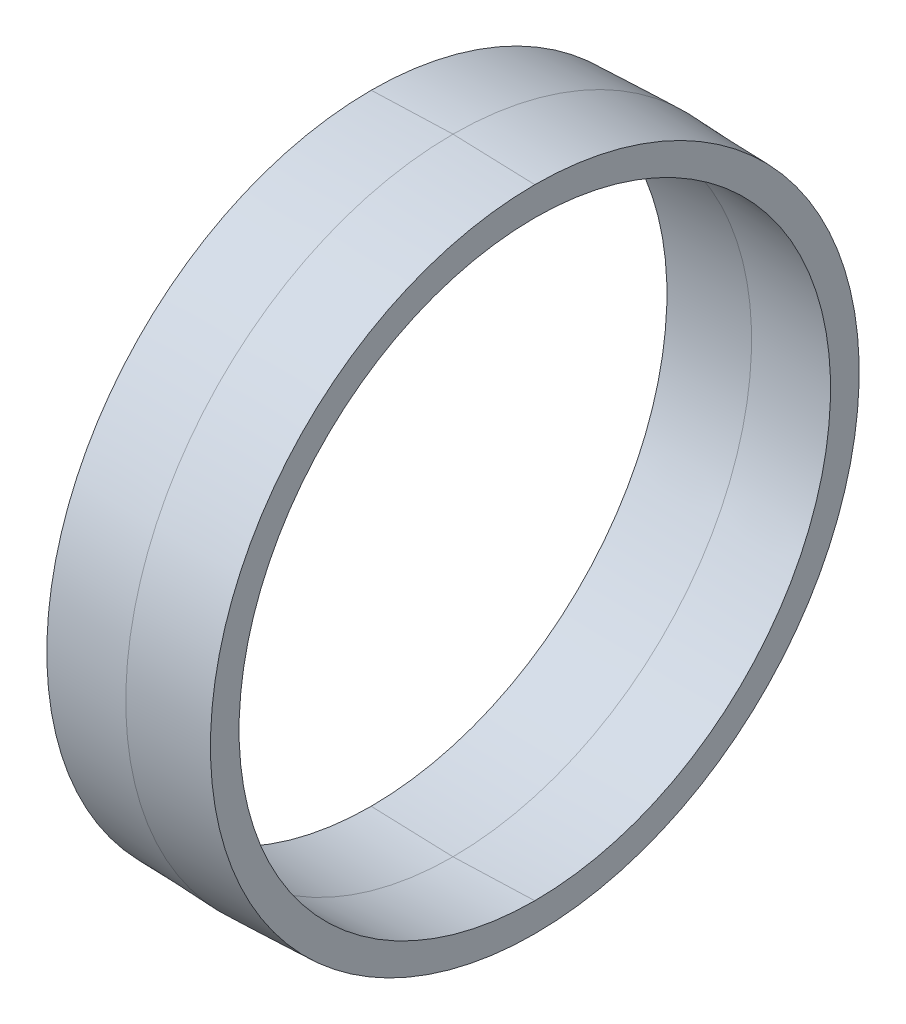
ISO-10303-21;
HEADER;
FILE_DESCRIPTION(('STEP AP214'),'2;1');
FILE_NAME('part.step','',(''),(''),'','','');
FILE_SCHEMA(('AUTOMOTIVE_DESIGN { 1 0 10303 214 1 1 1 1 }'));
ENDSEC;
DATA;
#1=APPLICATION_CONTEXT('core data for automotive mechanical design processes');
#2=APPLICATION_PROTOCOL_DEFINITION('international standard','automotive_design',2000,#1);
#3=PRODUCT_CONTEXT('',#1,'mechanical');
#4=PRODUCT('Part','Part','',(#3));
#5=PRODUCT_RELATED_PRODUCT_CATEGORY('part','',(#4));
#6=PRODUCT_DEFINITION_FORMATION('','',#4);
#7=PRODUCT_DEFINITION_CONTEXT('part definition',#1,'design');
#8=PRODUCT_DEFINITION('design','',#6,#7);
#9=PRODUCT_DEFINITION_SHAPE('','',#8);
#10=(LENGTH_UNIT() NAMED_UNIT(*) SI_UNIT(.MILLI.,.METRE.));
#11=(NAMED_UNIT(*) PLANE_ANGLE_UNIT() SI_UNIT($,.RADIAN.));
#12=(NAMED_UNIT(*) SI_UNIT($,.STERADIAN.) SOLID_ANGLE_UNIT());
#13=UNCERTAINTY_MEASURE_WITH_UNIT(LENGTH_MEASURE(1.E-05),#10,'distance_accuracy_value','');
#14=(GEOMETRIC_REPRESENTATION_CONTEXT(3) GLOBAL_UNCERTAINTY_ASSIGNED_CONTEXT((#13)) GLOBAL_UNIT_ASSIGNED_CONTEXT((#10,
#11,#12)) REPRESENTATION_CONTEXT('',''));
#15=CARTESIAN_POINT('',(0.,0.,0.));
#16=DIRECTION('',(0.,0.,1.));
#17=DIRECTION('',(1.,0.,0.));
#18=AXIS2_PLACEMENT_3D('',#15,#16,#17);
#19=CARTESIAN_POINT('',(-1.2240662460568,0.,0.));
#20=DIRECTION('',(-1.,0.,0.));
#21=DIRECTION('',(0.,-1.,0.));
#22=AXIS2_PLACEMENT_3D('',#19,#20,#21);
#23=CONICAL_SURFACE('',#22,50.8,0.0349065850398793);
#24=CARTESIAN_POINT('',(11.4759337539432,0.,0.));
#25=DIRECTION('',(-1.,0.,0.));
#26=DIRECTION('',(0.,-1.,0.));
#27=AXIS2_PLACEMENT_3D('',#24,#25,#26);
#28=CIRCLE('',#27,50.3565062274549);
#29=CARTESIAN_POINT('',(11.4759337539432,-50.3565062274549,0.));
#30=VERTEX_POINT('',#29);
#31=CARTESIAN_POINT('',(11.4759337539432,50.3565062274549,0.));
#32=VERTEX_POINT('',#31);
#33=EDGE_CURVE('E11',#30,#32,#28,.T.);
#34=ORIENTED_EDGE('',*,*,#33,.T.);
#35=DIRECTION('',(-0.999390827019096,0.0348994967024925,0.));
#36=VECTOR('',#35,1.);
#37=CARTESIAN_POINT('',(-1.22406624605681,50.8,0.));
#38=LINE('',#37,#36);
#39=CARTESIAN_POINT('',(-1.22406624605676,50.8,0.));
#40=VERTEX_POINT('',#39);
#41=EDGE_CURVE('E27',#32,#40,#38,.T.);
#42=ORIENTED_EDGE('',*,*,#41,.T.);
#43=CARTESIAN_POINT('',(-1.22406624605675,0.,0.));
#44=DIRECTION('',(1.,0.,0.));
#45=DIRECTION('',(0.,-1.,0.));
#46=AXIS2_PLACEMENT_3D('',#43,#44,#45);
#47=CIRCLE('',#46,50.8);
#48=CARTESIAN_POINT('',(-1.22406624605675,-50.8,0.));
#49=VERTEX_POINT('',#48);
#50=EDGE_CURVE('E159',#40,#49,#47,.T.);
#51=ORIENTED_EDGE('',*,*,#50,.T.);
#52=DIRECTION('',(-0.999390827019096,-0.0348994967024927,0.));
#53=VECTOR('',#52,1.);
#54=CARTESIAN_POINT('',(-1.2240662460568,-50.8,0.));
#55=LINE('',#54,#53);
#56=EDGE_CURVE('E136',#30,#49,#55,.T.);
#57=ORIENTED_EDGE('',*,*,#56,.F.);
#58=EDGE_LOOP('',(#34,#42,#51,#57));
#59=FACE_BOUND('',#58,.T.);
#60=ADVANCED_FACE('F16',(#59),#23,.T.);
#61=CARTESIAN_POINT('',(-1.22406624605671,0.,0.));
#62=DIRECTION('',(1.,0.,0.));
#63=DIRECTION('',(0.,1.,0.));
#64=AXIS2_PLACEMENT_3D('',#61,#62,#63);
#65=CONICAL_SURFACE('',#64,50.8,0.0349065850398793);
#66=CARTESIAN_POINT('',(-13.9240662460567,0.,0.));
#67=DIRECTION('',(1.,0.,0.));
#68=DIRECTION('',(0.,1.,0.));
#69=AXIS2_PLACEMENT_3D('',#66,#67,#68);
#70=CIRCLE('',#69,50.3565062274549);
#71=CARTESIAN_POINT('',(-13.9240662460567,50.3565062274549,0.));
#72=VERTEX_POINT('',#71);
#73=CARTESIAN_POINT('',(-13.9240662460567,-50.3565062274549,0.));
#74=VERTEX_POINT('',#73);
#75=EDGE_CURVE('E157',#72,#74,#70,.T.);
#76=ORIENTED_EDGE('',*,*,#75,.T.);
#77=DIRECTION('',(0.999390827019096,-0.0348994967024938,0.));
#78=VECTOR('',#77,1.);
#79=CARTESIAN_POINT('',(-1.2240662460567,-50.8,0.));
#80=LINE('',#79,#78);
#81=EDGE_CURVE('E160',#74,#49,#80,.T.);
#82=ORIENTED_EDGE('',*,*,#81,.T.);
#83=ORIENTED_EDGE('',*,*,#50,.F.);
#84=DIRECTION('',(0.999390827019096,0.0348994967024939,0.));
#85=VECTOR('',#84,1.);
#86=CARTESIAN_POINT('',(-1.22406624605671,50.8,0.));
#87=LINE('',#86,#85);
#88=EDGE_CURVE('E78',#72,#40,#87,.T.);
#89=ORIENTED_EDGE('',*,*,#88,.F.);
#90=EDGE_LOOP('',(#76,#82,#83,#89));
#91=FACE_BOUND('',#90,.T.);
#92=ADVANCED_FACE('F187',(#91),#65,.T.);
#93=CARTESIAN_POINT('',(-1.22406624605684,0.,0.));
#94=DIRECTION('',(-1.,0.,0.));
#95=DIRECTION('',(0.,-1.,0.));
#96=AXIS2_PLACEMENT_3D('',#93,#94,#95);
#97=CONICAL_SURFACE('',#96,46.355,0.0349065850398793);
#98=CARTESIAN_POINT('',(11.4759337539432,0.,0.));
#99=DIRECTION('',(1.,0.,0.));
#100=DIRECTION('',(0.,-1.,0.));
#101=AXIS2_PLACEMENT_3D('',#98,#99,#100);
#102=CIRCLE('',#101,45.9115062274549);
#103=CARTESIAN_POINT('',(11.4759337539432,-45.9115062274549,0.));
#104=VERTEX_POINT('',#103);
#105=CARTESIAN_POINT('',(11.4759337539432,45.9115062274549,0.));
#106=VERTEX_POINT('',#105);
#107=EDGE_CURVE('E122',#104,#106,#102,.T.);
#108=ORIENTED_EDGE('',*,*,#107,.T.);
#109=DIRECTION('',(-0.999390827019096,0.0348994967024931,0.));
#110=VECTOR('',#109,1.);
#111=CARTESIAN_POINT('',(-1.22406624605685,46.355,0.));
#112=LINE('',#111,#110);
#113=CARTESIAN_POINT('',(-1.22406624605676,46.355,0.));
#114=VERTEX_POINT('',#113);
#115=EDGE_CURVE('E92',#106,#114,#112,.T.);
#116=ORIENTED_EDGE('',*,*,#115,.T.);
#117=CARTESIAN_POINT('',(-1.22406624605675,0.,0.));
#118=DIRECTION('',(1.,0.,0.));
#119=DIRECTION('',(0.,-1.,0.));
#120=AXIS2_PLACEMENT_3D('',#117,#118,#119);
#121=CIRCLE('',#120,46.355);
#122=CARTESIAN_POINT('',(-1.22406624605675,-46.355,0.));
#123=VERTEX_POINT('',#122);
#124=EDGE_CURVE('E113',#123,#114,#121,.T.);
#125=ORIENTED_EDGE('',*,*,#124,.F.);
#126=DIRECTION('',(-0.999390827019096,-0.0348994967024932,0.));
#127=VECTOR('',#126,1.);
#128=CARTESIAN_POINT('',(-1.22406624605684,-46.355,0.));
#129=LINE('',#128,#127);
#130=EDGE_CURVE('E128',#104,#123,#129,.T.);
#131=ORIENTED_EDGE('',*,*,#130,.F.);
#132=EDGE_LOOP('',(#108,#116,#125,#131));
#133=FACE_BOUND('',#132,.T.);
#134=ADVANCED_FACE('F120',(#133),#97,.F.);
#135=CARTESIAN_POINT('',(-1.22406624605667,0.,0.));
#136=DIRECTION('',(1.,0.,0.));
#137=DIRECTION('',(0.,1.,0.));
#138=AXIS2_PLACEMENT_3D('',#135,#136,#137);
#139=CONICAL_SURFACE('',#138,46.355,0.0349065850398793);
#140=CARTESIAN_POINT('',(-13.9240662460567,0.,0.));
#141=DIRECTION('',(-1.,0.,0.));
#142=DIRECTION('',(0.,1.,0.));
#143=AXIS2_PLACEMENT_3D('',#140,#141,#142);
#144=CIRCLE('',#143,45.9115062274549);
#145=CARTESIAN_POINT('',(-13.9240662460567,45.9115062274549,0.));
#146=VERTEX_POINT('',#145);
#147=CARTESIAN_POINT('',(-13.9240662460567,-45.9115062274549,0.));
#148=VERTEX_POINT('',#147);
#149=EDGE_CURVE('E125',#146,#148,#144,.T.);
#150=ORIENTED_EDGE('',*,*,#149,.T.);
#151=DIRECTION('',(0.999390827019096,-0.0348994967024937,0.));
#152=VECTOR('',#151,1.);
#153=CARTESIAN_POINT('',(-1.22406624605666,-46.355,0.));
#154=LINE('',#153,#152);
#155=EDGE_CURVE('E115',#148,#123,#154,.T.);
#156=ORIENTED_EDGE('',*,*,#155,.T.);
#157=ORIENTED_EDGE('',*,*,#124,.T.);
#158=DIRECTION('',(0.999390827019096,0.0348994967024938,0.));
#159=VECTOR('',#158,1.);
#160=CARTESIAN_POINT('',(-1.22406624605667,46.355,0.));
#161=LINE('',#160,#159);
#162=EDGE_CURVE('E101',#146,#114,#161,.T.);
#163=ORIENTED_EDGE('',*,*,#162,.F.);
#164=EDGE_LOOP('',(#150,#156,#157,#163));
#165=FACE_BOUND('',#164,.T.);
#166=ADVANCED_FACE('F114',(#165),#139,.F.);
#167=CARTESIAN_POINT('',(-1.2240662460568,0.,0.));
#168=DIRECTION('',(-1.,0.,0.));
#169=DIRECTION('',(0.,-1.,0.));
#170=AXIS2_PLACEMENT_3D('',#167,#168,#169);
#171=CONICAL_SURFACE('',#170,50.8,0.0349065850398793);
#172=ORIENTED_EDGE('',*,*,#41,.F.);
#173=CARTESIAN_POINT('',(11.4759337539432,0.,0.));
#174=DIRECTION('',(-1.,0.,0.));
#175=DIRECTION('',(0.,-1.,0.));
#176=AXIS2_PLACEMENT_3D('',#173,#174,#175);
#177=CIRCLE('',#176,50.3565062274549);
#178=EDGE_CURVE('E118',#32,#30,#177,.T.);
#179=ORIENTED_EDGE('',*,*,#178,.T.);
#180=ORIENTED_EDGE('',*,*,#56,.T.);
#181=CARTESIAN_POINT('',(-1.22406624605675,0.,0.));
#182=DIRECTION('',(1.,0.,0.));
#183=DIRECTION('',(0.,-1.,0.));
#184=AXIS2_PLACEMENT_3D('',#181,#182,#183);
#185=CIRCLE('',#184,50.8);
#186=EDGE_CURVE('E137',#49,#40,#185,.T.);
#187=ORIENTED_EDGE('',*,*,#186,.T.);
#188=EDGE_LOOP('',(#172,#179,#180,#187));
#189=FACE_BOUND('',#188,.T.);
#190=ADVANCED_FACE('F181',(#189),#171,.T.);
#191=CARTESIAN_POINT('',(-1.22406624605671,0.,0.));
#192=DIRECTION('',(1.,0.,0.));
#193=DIRECTION('',(0.,1.,0.));
#194=AXIS2_PLACEMENT_3D('',#191,#192,#193);
#195=CONICAL_SURFACE('',#194,50.8,0.0349065850398793);
#196=ORIENTED_EDGE('',*,*,#81,.F.);
#197=CARTESIAN_POINT('',(-13.9240662460567,0.,0.));
#198=DIRECTION('',(1.,0.,0.));
#199=DIRECTION('',(0.,1.,0.));
#200=AXIS2_PLACEMENT_3D('',#197,#198,#199);
#201=CIRCLE('',#200,50.3565062274549);
#202=EDGE_CURVE('E138',#74,#72,#201,.T.);
#203=ORIENTED_EDGE('',*,*,#202,.T.);
#204=ORIENTED_EDGE('',*,*,#88,.T.);
#205=ORIENTED_EDGE('',*,*,#186,.F.);
#206=EDGE_LOOP('',(#196,#203,#204,#205));
#207=FACE_BOUND('',#206,.T.);
#208=ADVANCED_FACE('F18',(#207),#195,.T.);
#209=CARTESIAN_POINT('',(11.4759337539432,50.3565062274549,0.));
#210=DIRECTION('',(-1.,0.,0.));
#211=DIRECTION('',(0.,1.,0.));
#212=AXIS2_PLACEMENT_3D('',#209,#210,#211);
#213=PLANE('',#212);
#214=ORIENTED_EDGE('',*,*,#33,.F.);
#215=ORIENTED_EDGE('',*,*,#178,.F.);
#216=EDGE_LOOP('',(#214,#215));
#217=FACE_BOUND('',#216,.T.);
#218=ORIENTED_EDGE('',*,*,#107,.F.);
#219=CARTESIAN_POINT('',(11.4759337539432,0.,0.));
#220=DIRECTION('',(1.,0.,0.));
#221=DIRECTION('',(0.,-1.,0.));
#222=AXIS2_PLACEMENT_3D('',#219,#220,#221);
#223=CIRCLE('',#222,45.9115062274549);
#224=EDGE_CURVE('E149',#106,#104,#223,.T.);
#225=ORIENTED_EDGE('',*,*,#224,.F.);
#226=EDGE_LOOP('',(#218,#225));
#227=FACE_BOUND('',#226,.T.);
#228=ADVANCED_FACE('F184',(#217,#227),#213,.F.);
#229=CARTESIAN_POINT('',(-13.9240662460568,45.9115062274549,0.));
#230=DIRECTION('',(1.,0.,0.));
#231=DIRECTION('',(0.,1.,0.));
#232=AXIS2_PLACEMENT_3D('',#229,#230,#231);
#233=PLANE('',#232);
#234=ORIENTED_EDGE('',*,*,#75,.F.);
#235=ORIENTED_EDGE('',*,*,#202,.F.);
#236=EDGE_LOOP('',(#234,#235));
#237=FACE_BOUND('',#236,.T.);
#238=ORIENTED_EDGE('',*,*,#149,.F.);
#239=CARTESIAN_POINT('',(-13.9240662460567,0.,0.));
#240=DIRECTION('',(-1.,0.,0.));
#241=DIRECTION('',(0.,1.,0.));
#242=AXIS2_PLACEMENT_3D('',#239,#240,#241);
#243=CIRCLE('',#242,45.9115062274549);
#244=EDGE_CURVE('E20',#148,#146,#243,.T.);
#245=ORIENTED_EDGE('',*,*,#244,.F.);
#246=EDGE_LOOP('',(#238,#245));
#247=FACE_BOUND('',#246,.T.);
#248=ADVANCED_FACE('F189',(#237,#247),#233,.F.);
#249=CARTESIAN_POINT('',(-1.22406624605684,0.,0.));
#250=DIRECTION('',(-1.,0.,0.));
#251=DIRECTION('',(0.,-1.,0.));
#252=AXIS2_PLACEMENT_3D('',#249,#250,#251);
#253=CONICAL_SURFACE('',#252,46.355,0.0349065850398793);
#254=ORIENTED_EDGE('',*,*,#115,.F.);
#255=ORIENTED_EDGE('',*,*,#224,.T.);
#256=ORIENTED_EDGE('',*,*,#130,.T.);
#257=CARTESIAN_POINT('',(-1.22406624605675,0.,0.));
#258=DIRECTION('',(1.,0.,0.));
#259=DIRECTION('',(0.,-1.,0.));
#260=AXIS2_PLACEMENT_3D('',#257,#258,#259);
#261=CIRCLE('',#260,46.355);
#262=EDGE_CURVE('E104',#114,#123,#261,.T.);
#263=ORIENTED_EDGE('',*,*,#262,.F.);
#264=EDGE_LOOP('',(#254,#255,#256,#263));
#265=FACE_BOUND('',#264,.T.);
#266=ADVANCED_FACE('F127',(#265),#253,.F.);
#267=CARTESIAN_POINT('',(-1.22406624605667,0.,0.));
#268=DIRECTION('',(1.,0.,0.));
#269=DIRECTION('',(0.,1.,0.));
#270=AXIS2_PLACEMENT_3D('',#267,#268,#269);
#271=CONICAL_SURFACE('',#270,46.355,0.0349065850398793);
#272=ORIENTED_EDGE('',*,*,#155,.F.);
#273=ORIENTED_EDGE('',*,*,#244,.T.);
#274=ORIENTED_EDGE('',*,*,#162,.T.);
#275=ORIENTED_EDGE('',*,*,#262,.T.);
#276=EDGE_LOOP('',(#272,#273,#274,#275));
#277=FACE_BOUND('',#276,.T.);
#278=ADVANCED_FACE('F103',(#277),#271,.F.);
#279=CLOSED_SHELL('',(#60,#92,#134,#166,#190,#208,#228,#248,#266,#278));
#280=MANIFOLD_SOLID_BREP('B1',#279);
#281=ADVANCED_BREP_SHAPE_REPRESENTATION('',(#18,#280),#14);
#282=SHAPE_DEFINITION_REPRESENTATION(#9,#281);
ENDSEC;
END-ISO-10303-21;
